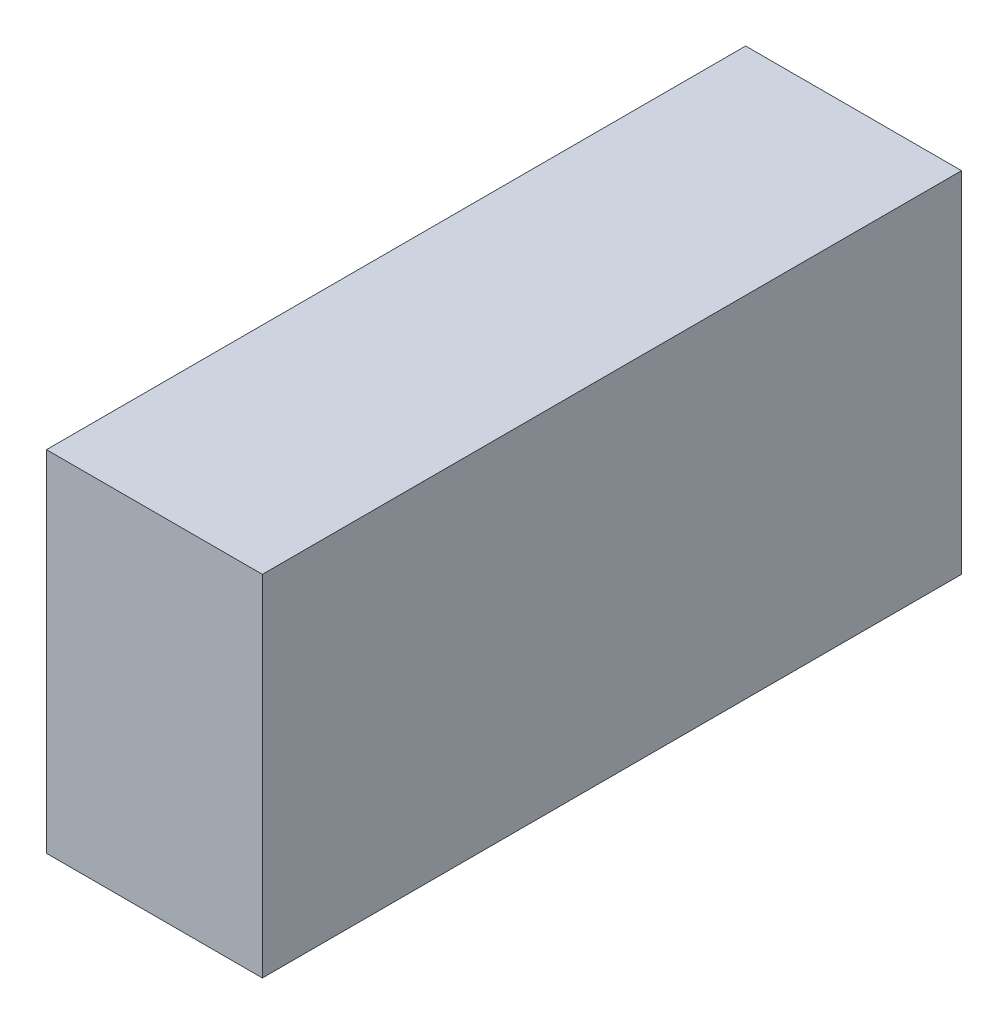
ISO-10303-21;
HEADER;
FILE_DESCRIPTION(('STEP AP214'),'2;1');
FILE_NAME('part.step','',(''),(''),'','','');
FILE_SCHEMA(('AUTOMOTIVE_DESIGN { 1 0 10303 214 1 1 1 1 }'));
ENDSEC;
DATA;
#1=APPLICATION_CONTEXT('core data for automotive mechanical design processes');
#2=APPLICATION_PROTOCOL_DEFINITION('international standard','automotive_design',2000,#1);
#3=PRODUCT_CONTEXT('',#1,'mechanical');
#4=PRODUCT('Part','Part','',(#3));
#5=PRODUCT_RELATED_PRODUCT_CATEGORY('part','',(#4));
#6=PRODUCT_DEFINITION_FORMATION('','',#4);
#7=PRODUCT_DEFINITION_CONTEXT('part definition',#1,'design');
#8=PRODUCT_DEFINITION('design','',#6,#7);
#9=PRODUCT_DEFINITION_SHAPE('','',#8);
#10=(LENGTH_UNIT() NAMED_UNIT(*) SI_UNIT(.MILLI.,.METRE.));
#11=(NAMED_UNIT(*) PLANE_ANGLE_UNIT() SI_UNIT($,.RADIAN.));
#12=(NAMED_UNIT(*) SI_UNIT($,.STERADIAN.) SOLID_ANGLE_UNIT());
#13=UNCERTAINTY_MEASURE_WITH_UNIT(LENGTH_MEASURE(1.E-05),#10,'distance_accuracy_value','');
#14=(GEOMETRIC_REPRESENTATION_CONTEXT(3) GLOBAL_UNCERTAINTY_ASSIGNED_CONTEXT((#13)) GLOBAL_UNIT_ASSIGNED_CONTEXT((#10,
#11,#12)) REPRESENTATION_CONTEXT('',''));
#15=CARTESIAN_POINT('',(0.,0.,0.));
#16=DIRECTION('',(0.,0.,1.));
#17=DIRECTION('',(1.,0.,0.));
#18=AXIS2_PLACEMENT_3D('',#15,#16,#17);
#19=CARTESIAN_POINT('',(42.,68.,0.));
#20=DIRECTION('',(0.,0.,-1.));
#21=DIRECTION('',(-1.,0.,0.));
#22=AXIS2_PLACEMENT_3D('',#19,#20,#21);
#23=PLANE('',#22);
#24=DIRECTION('',(1.,0.,0.));
#25=VECTOR('',#24,1.);
#26=CARTESIAN_POINT('',(42.,0.,0.));
#27=LINE('',#26,#25);
#28=CARTESIAN_POINT('',(0.,0.,0.));
#29=VERTEX_POINT('',#28);
#30=CARTESIAN_POINT('',(42.,0.,0.));
#31=VERTEX_POINT('',#30);
#32=EDGE_CURVE('E109',#29,#31,#27,.T.);
#33=ORIENTED_EDGE('',*,*,#32,.T.);
#34=DIRECTION('',(0.,-1.,0.));
#35=VECTOR('',#34,1.);
#36=CARTESIAN_POINT('',(42.,68.,0.));
#37=LINE('',#36,#35);
#38=CARTESIAN_POINT('',(42.,68.,0.));
#39=VERTEX_POINT('',#38);
#40=EDGE_CURVE('E11',#39,#31,#37,.T.);
#41=ORIENTED_EDGE('',*,*,#40,.F.);
#42=DIRECTION('',(1.,0.,0.));
#43=VECTOR('',#42,1.);
#44=CARTESIAN_POINT('',(42.,68.,0.));
#45=LINE('',#44,#43);
#46=CARTESIAN_POINT('',(0.,68.,0.));
#47=VERTEX_POINT('',#46);
#48=EDGE_CURVE('E93',#47,#39,#45,.T.);
#49=ORIENTED_EDGE('',*,*,#48,.F.);
#50=DIRECTION('',(0.,-1.,0.));
#51=VECTOR('',#50,1.);
#52=CARTESIAN_POINT('',(0.,68.,0.));
#53=LINE('',#52,#51);
#54=EDGE_CURVE('E105',#47,#29,#53,.T.);
#55=ORIENTED_EDGE('',*,*,#54,.T.);
#56=EDGE_LOOP('',(#33,#41,#49,#55));
#57=FACE_BOUND('',#56,.T.);
#58=ADVANCED_FACE('F41',(#57),#23,.F.);
#59=CARTESIAN_POINT('',(42.,68.,-136.));
#60=DIRECTION('',(-1.,0.,0.));
#61=DIRECTION('',(0.,0.,1.));
#62=AXIS2_PLACEMENT_3D('',#59,#60,#61);
#63=PLANE('',#62);
#64=DIRECTION('',(0.,0.,-1.));
#65=VECTOR('',#64,1.);
#66=CARTESIAN_POINT('',(42.,0.,-136.));
#67=LINE('',#66,#65);
#68=CARTESIAN_POINT('',(42.,0.,-136.));
#69=VERTEX_POINT('',#68);
#70=EDGE_CURVE('E98',#31,#69,#67,.T.);
#71=ORIENTED_EDGE('',*,*,#70,.T.);
#72=DIRECTION('',(0.,-1.,0.));
#73=VECTOR('',#72,1.);
#74=CARTESIAN_POINT('',(42.,68.,-136.));
#75=LINE('',#74,#73);
#76=CARTESIAN_POINT('',(42.,68.,-136.));
#77=VERTEX_POINT('',#76);
#78=EDGE_CURVE('E50',#77,#69,#75,.T.);
#79=ORIENTED_EDGE('',*,*,#78,.F.);
#80=DIRECTION('',(0.,0.,-1.));
#81=VECTOR('',#80,1.);
#82=CARTESIAN_POINT('',(42.,68.,-136.));
#83=LINE('',#82,#81);
#84=EDGE_CURVE('E88',#39,#77,#83,.T.);
#85=ORIENTED_EDGE('',*,*,#84,.F.);
#86=ORIENTED_EDGE('',*,*,#40,.T.);
#87=EDGE_LOOP('',(#71,#79,#85,#86));
#88=FACE_BOUND('',#87,.T.);
#89=ADVANCED_FACE('F97',(#88),#63,.F.);
#90=CARTESIAN_POINT('',(0.,68.,-136.));
#91=DIRECTION('',(0.,0.,1.));
#92=DIRECTION('',(1.,0.,0.));
#93=AXIS2_PLACEMENT_3D('',#90,#91,#92);
#94=PLANE('',#93);
#95=DIRECTION('',(-1.,0.,0.));
#96=VECTOR('',#95,1.);
#97=CARTESIAN_POINT('',(0.,0.,-136.));
#98=LINE('',#97,#96);
#99=CARTESIAN_POINT('',(0.,0.,-136.));
#100=VERTEX_POINT('',#99);
#101=EDGE_CURVE('E75',#69,#100,#98,.T.);
#102=ORIENTED_EDGE('',*,*,#101,.T.);
#103=DIRECTION('',(0.,-1.,0.));
#104=VECTOR('',#103,1.);
#105=CARTESIAN_POINT('',(0.,68.,-136.));
#106=LINE('',#105,#104);
#107=CARTESIAN_POINT('',(0.,68.,-136.));
#108=VERTEX_POINT('',#107);
#109=EDGE_CURVE('E100',#108,#100,#106,.T.);
#110=ORIENTED_EDGE('',*,*,#109,.F.);
#111=DIRECTION('',(-1.,0.,0.));
#112=VECTOR('',#111,1.);
#113=CARTESIAN_POINT('',(0.,68.,-136.));
#114=LINE('',#113,#112);
#115=EDGE_CURVE('E91',#77,#108,#114,.T.);
#116=ORIENTED_EDGE('',*,*,#115,.F.);
#117=ORIENTED_EDGE('',*,*,#78,.T.);
#118=EDGE_LOOP('',(#102,#110,#116,#117));
#119=FACE_BOUND('',#118,.T.);
#120=ADVANCED_FACE('F101',(#119),#94,.F.);
#121=CARTESIAN_POINT('',(0.,68.,0.));
#122=DIRECTION('',(1.,0.,0.));
#123=DIRECTION('',(0.,0.,-1.));
#124=AXIS2_PLACEMENT_3D('',#121,#122,#123);
#125=PLANE('',#124);
#126=DIRECTION('',(0.,0.,1.));
#127=VECTOR('',#126,1.);
#128=CARTESIAN_POINT('',(0.,0.,0.));
#129=LINE('',#128,#127);
#130=EDGE_CURVE('E81',#100,#29,#129,.T.);
#131=ORIENTED_EDGE('',*,*,#130,.T.);
#132=ORIENTED_EDGE('',*,*,#54,.F.);
#133=DIRECTION('',(0.,0.,1.));
#134=VECTOR('',#133,1.);
#135=CARTESIAN_POINT('',(0.,68.,0.));
#136=LINE('',#135,#134);
#137=EDGE_CURVE('E58',#108,#47,#136,.T.);
#138=ORIENTED_EDGE('',*,*,#137,.F.);
#139=ORIENTED_EDGE('',*,*,#109,.T.);
#140=EDGE_LOOP('',(#131,#132,#138,#139));
#141=FACE_BOUND('',#140,.T.);
#142=ADVANCED_FACE('F122',(#141),#125,.F.);
#143=CARTESIAN_POINT('',(0.,68.,0.));
#144=DIRECTION('',(0.,-1.,0.));
#145=DIRECTION('',(0.,0.,-1.));
#146=AXIS2_PLACEMENT_3D('',#143,#144,#145);
#147=PLANE('',#146);
#148=ORIENTED_EDGE('',*,*,#48,.T.);
#149=ORIENTED_EDGE('',*,*,#84,.T.);
#150=ORIENTED_EDGE('',*,*,#115,.T.);
#151=ORIENTED_EDGE('',*,*,#137,.T.);
#152=EDGE_LOOP('',(#148,#149,#150,#151));
#153=FACE_BOUND('',#152,.T.);
#154=ADVANCED_FACE('F89',(#153),#147,.F.);
#155=CARTESIAN_POINT('',(0.,0.,0.));
#156=DIRECTION('',(0.,-1.,0.));
#157=DIRECTION('',(0.,0.,-1.));
#158=AXIS2_PLACEMENT_3D('',#155,#156,#157);
#159=PLANE('',#158);
#160=ORIENTED_EDGE('',*,*,#32,.F.);
#161=ORIENTED_EDGE('',*,*,#130,.F.);
#162=ORIENTED_EDGE('',*,*,#101,.F.);
#163=ORIENTED_EDGE('',*,*,#70,.F.);
#164=EDGE_LOOP('',(#160,#161,#162,#163));
#165=FACE_BOUND('',#164,.T.);
#166=ADVANCED_FACE('F125',(#165),#159,.T.);
#167=CLOSED_SHELL('',(#58,#89,#120,#142,#154,#166));
#168=MANIFOLD_SOLID_BREP('B2',#167);
#169=ADVANCED_BREP_SHAPE_REPRESENTATION('',(#18,#168),#14);
#170=SHAPE_DEFINITION_REPRESENTATION(#9,#169);
ENDSEC;
END-ISO-10303-21;
